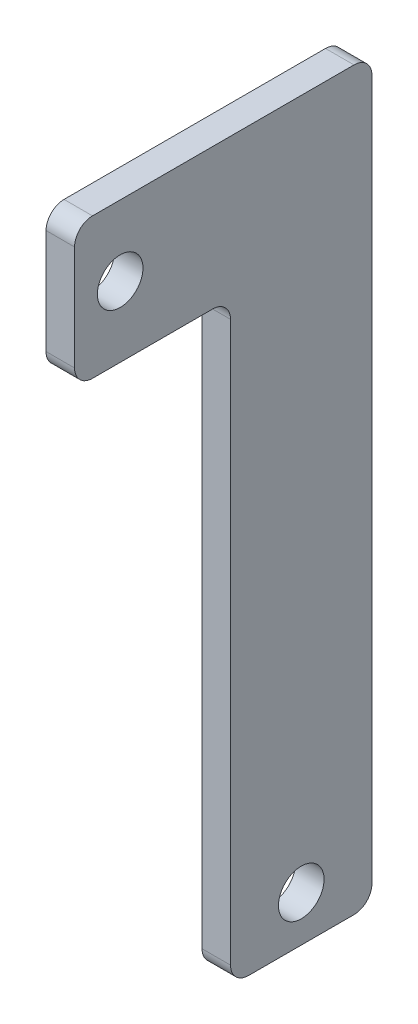
ISO-10303-21;
HEADER;
FILE_DESCRIPTION(('STEP AP214'),'2;1');
FILE_NAME('part.step','',(''),(''),'','','');
FILE_SCHEMA(('AUTOMOTIVE_DESIGN { 1 0 10303 214 1 1 1 1 }'));
ENDSEC;
DATA;
#1=APPLICATION_CONTEXT('core data for automotive mechanical design processes');
#2=APPLICATION_PROTOCOL_DEFINITION('international standard','automotive_design',2000,#1);
#3=PRODUCT_CONTEXT('',#1,'mechanical');
#4=PRODUCT('Part','Part','',(#3));
#5=PRODUCT_RELATED_PRODUCT_CATEGORY('part','',(#4));
#6=PRODUCT_DEFINITION_FORMATION('','',#4);
#7=PRODUCT_DEFINITION_CONTEXT('part definition',#1,'design');
#8=PRODUCT_DEFINITION('design','',#6,#7);
#9=PRODUCT_DEFINITION_SHAPE('','',#8);
#10=(LENGTH_UNIT() NAMED_UNIT(*) SI_UNIT(.MILLI.,.METRE.));
#11=(NAMED_UNIT(*) PLANE_ANGLE_UNIT() SI_UNIT($,.RADIAN.));
#12=(NAMED_UNIT(*) SI_UNIT($,.STERADIAN.) SOLID_ANGLE_UNIT());
#13=UNCERTAINTY_MEASURE_WITH_UNIT(LENGTH_MEASURE(1.E-05),#10,'distance_accuracy_value','');
#14=(GEOMETRIC_REPRESENTATION_CONTEXT(3) GLOBAL_UNCERTAINTY_ASSIGNED_CONTEXT((#13)) GLOBAL_UNIT_ASSIGNED_CONTEXT((#10,
#11,#12)) REPRESENTATION_CONTEXT('',''));
#15=CARTESIAN_POINT('',(0.,0.,0.));
#16=DIRECTION('',(0.,0.,1.));
#17=DIRECTION('',(1.,0.,0.));
#18=AXIS2_PLACEMENT_3D('',#15,#16,#17);
#19=CARTESIAN_POINT('',(-46.2500329826111,127.917372069071,94.0054482425765));
#20=DIRECTION('',(0.,0.,1.));
#21=DIRECTION('',(1.,0.,0.));
#22=AXIS2_PLACEMENT_3D('',#19,#20,#21);
#23=PLANE('',#22);
#24=DIRECTION('',(0.,1.,0.));
#25=VECTOR('',#24,1.);
#26=CARTESIAN_POINT('',(-46.2500329826111,127.917372069071,94.0054482425765));
#27=LINE('',#26,#25);
#28=CARTESIAN_POINT('',(-46.2500329826111,129.917372069071,94.0054482425765));
#29=VERTEX_POINT('',#28);
#30=CARTESIAN_POINT('',(-46.2500329826114,207.868558181533,94.0054482425765));
#31=VERTEX_POINT('',#30);
#32=EDGE_CURVE('E159',#29,#31,#27,.T.);
#33=ORIENTED_EDGE('',*,*,#32,.F.);
#34=DIRECTION('',(-1.,0.,0.));
#35=VECTOR('',#34,1.);
#36=CARTESIAN_POINT('',(-46.2500329826111,129.917372069071,94.0054482425765));
#37=LINE('',#36,#35);
#38=CARTESIAN_POINT('',(-49.4250329826111,129.917372069071,94.0054482425765));
#39=VERTEX_POINT('',#38);
#40=EDGE_CURVE('E190',#29,#39,#37,.T.);
#41=ORIENTED_EDGE('',*,*,#40,.T.);
#42=DIRECTION('',(0.,1.,0.));
#43=VECTOR('',#42,1.);
#44=CARTESIAN_POINT('',(-49.4250329826111,127.917372069071,94.0054482425765));
#45=LINE('',#44,#43);
#46=CARTESIAN_POINT('',(-49.4250329826114,207.868558181533,94.0054482425765));
#47=VERTEX_POINT('',#46);
#48=EDGE_CURVE('E227',#39,#47,#45,.T.);
#49=ORIENTED_EDGE('',*,*,#48,.T.);
#50=DIRECTION('',(-1.,0.,0.));
#51=VECTOR('',#50,1.);
#52=CARTESIAN_POINT('',(-46.2500329826114,207.868558181533,94.0054482425765));
#53=LINE('',#52,#51);
#54=EDGE_CURVE('E188',#47,#31,#53,.F.);
#55=ORIENTED_EDGE('',*,*,#54,.T.);
#56=EDGE_LOOP('',(#33,#41,#49,#55));
#57=FACE_BOUND('',#56,.T.);
#58=ADVANCED_FACE('F43',(#57),#23,.F.);
#59=CARTESIAN_POINT('',(-46.2500329826114,209.868558181533,109.749301698677));
#60=DIRECTION('',(0.,-1.,0.));
#61=DIRECTION('',(1.,0.,0.));
#62=AXIS2_PLACEMENT_3D('',#59,#60,#61);
#63=PLANE('',#62);
#64=DIRECTION('',(0.,0.,1.));
#65=VECTOR('',#64,1.);
#66=CARTESIAN_POINT('',(-46.2500329826114,209.868558181533,94.0054482425765));
#67=LINE('',#66,#65);
#68=CARTESIAN_POINT('',(-46.2500329826114,209.868558181533,96.0054482425765));
#69=VERTEX_POINT('',#68);
#70=CARTESIAN_POINT('',(-46.2500329826114,209.868558181533,125.122990112191));
#71=VERTEX_POINT('',#70);
#72=EDGE_CURVE('E163',#69,#71,#67,.T.);
#73=ORIENTED_EDGE('',*,*,#72,.F.);
#74=DIRECTION('',(-1.,0.,0.));
#75=VECTOR('',#74,1.);
#76=CARTESIAN_POINT('',(-46.2500329826114,209.868558181533,96.0054482425765));
#77=LINE('',#76,#75);
#78=CARTESIAN_POINT('',(-49.4250329826114,209.868558181533,96.0054482425765));
#79=VERTEX_POINT('',#78);
#80=EDGE_CURVE('E195',#69,#79,#77,.T.);
#81=ORIENTED_EDGE('',*,*,#80,.T.);
#82=DIRECTION('',(0.,0.,1.));
#83=VECTOR('',#82,1.);
#84=CARTESIAN_POINT('',(-49.4250329826114,209.868558181533,109.749301698677));
#85=LINE('',#84,#83);
#86=CARTESIAN_POINT('',(-49.4250329826114,209.868558181533,125.122990112191));
#87=VERTEX_POINT('',#86);
#88=EDGE_CURVE('E230',#79,#87,#85,.T.);
#89=ORIENTED_EDGE('',*,*,#88,.T.);
#90=DIRECTION('',(-1.,0.,0.));
#91=VECTOR('',#90,1.);
#92=CARTESIAN_POINT('',(-46.2500329826114,209.868558181533,125.122990112191));
#93=LINE('',#92,#91);
#94=EDGE_CURVE('E193',#87,#71,#93,.F.);
#95=ORIENTED_EDGE('',*,*,#94,.T.);
#96=EDGE_LOOP('',(#73,#81,#89,#95));
#97=FACE_BOUND('',#96,.T.);
#98=ADVANCED_FACE('F249',(#97),#63,.F.);
#99=CARTESIAN_POINT('',(-46.2500329826114,209.868558181533,127.122990112191));
#100=DIRECTION('',(0.,0.,-1.));
#101=DIRECTION('',(-1.,0.,0.));
#102=AXIS2_PLACEMENT_3D('',#99,#100,#101);
#103=PLANE('',#102);
#104=DIRECTION('',(0.,-1.,0.));
#105=VECTOR('',#104,1.);
#106=CARTESIAN_POINT('',(-46.2500329826114,209.868558181533,127.122990112191));
#107=LINE('',#106,#105);
#108=CARTESIAN_POINT('',(-46.2500329826114,207.868558181533,127.122990112191));
#109=VERTEX_POINT('',#108);
#110=CARTESIAN_POINT('',(-46.2500329826113,196.197401704372,127.122990112191));
#111=VERTEX_POINT('',#110);
#112=EDGE_CURVE('E223',#109,#111,#107,.T.);
#113=ORIENTED_EDGE('',*,*,#112,.F.);
#114=DIRECTION('',(-1.,0.,0.));
#115=VECTOR('',#114,1.);
#116=CARTESIAN_POINT('',(-46.2500329826114,207.868558181533,127.122990112191));
#117=LINE('',#116,#115);
#118=CARTESIAN_POINT('',(-49.4250329826114,207.868558181533,127.122990112191));
#119=VERTEX_POINT('',#118);
#120=EDGE_CURVE('E204',#109,#119,#117,.T.);
#121=ORIENTED_EDGE('',*,*,#120,.T.);
#122=DIRECTION('',(0.,-1.,0.));
#123=VECTOR('',#122,1.);
#124=CARTESIAN_POINT('',(-49.4250329826114,209.868558181533,127.122990112191));
#125=LINE('',#124,#123);
#126=CARTESIAN_POINT('',(-49.4250329826113,196.197401704372,127.122990112191));
#127=VERTEX_POINT('',#126);
#128=EDGE_CURVE('E211',#119,#127,#125,.T.);
#129=ORIENTED_EDGE('',*,*,#128,.T.);
#130=DIRECTION('',(-1.,0.,0.));
#131=VECTOR('',#130,1.);
#132=CARTESIAN_POINT('',(-46.2500329826113,196.197401704372,127.122990112191));
#133=LINE('',#132,#131);
#134=EDGE_CURVE('E202',#127,#111,#133,.F.);
#135=ORIENTED_EDGE('',*,*,#134,.T.);
#136=EDGE_LOOP('',(#113,#121,#129,#135));
#137=FACE_BOUND('',#136,.T.);
#138=ADVANCED_FACE('F239',(#137),#103,.F.);
#139=CARTESIAN_POINT('',(-46.2500329826113,194.197401704372,109.749301698677));
#140=DIRECTION('',(0.,1.,0.));
#141=DIRECTION('',(-1.,0.,0.));
#142=AXIS2_PLACEMENT_3D('',#139,#140,#141);
#143=PLANE('',#142);
#144=DIRECTION('',(0.,0.,-1.));
#145=VECTOR('',#144,1.);
#146=CARTESIAN_POINT('',(-49.4250329826113,194.197401704372,109.749301698677));
#147=LINE('',#146,#145);
#148=CARTESIAN_POINT('',(-49.4250329826113,194.197401704372,125.122990112191));
#149=VERTEX_POINT('',#148);
#150=CARTESIAN_POINT('',(-49.4250329826113,194.197401704372,111.749301698677));
#151=VERTEX_POINT('',#150);
#152=EDGE_CURVE('E165',#149,#151,#147,.T.);
#153=ORIENTED_EDGE('',*,*,#152,.T.);
#154=DIRECTION('',(-1.,0.,0.));
#155=VECTOR('',#154,1.);
#156=CARTESIAN_POINT('',(-46.2500329826113,194.197401704372,111.749301698677));
#157=LINE('',#156,#155);
#158=CARTESIAN_POINT('',(-46.2500329826113,194.197401704372,111.749301698677));
#159=VERTEX_POINT('',#158);
#160=EDGE_CURVE('E58',#151,#159,#157,.F.);
#161=ORIENTED_EDGE('',*,*,#160,.T.);
#162=DIRECTION('',(0.,0.,-1.));
#163=VECTOR('',#162,1.);
#164=CARTESIAN_POINT('',(-46.2500329826113,194.197401704372,109.749301698677));
#165=LINE('',#164,#163);
#166=CARTESIAN_POINT('',(-46.2500329826113,194.197401704372,125.122990112191));
#167=VERTEX_POINT('',#166);
#168=EDGE_CURVE('E218',#167,#159,#165,.T.);
#169=ORIENTED_EDGE('',*,*,#168,.F.);
#170=DIRECTION('',(-1.,0.,0.));
#171=VECTOR('',#170,1.);
#172=CARTESIAN_POINT('',(-46.2500329826113,194.197401704372,125.122990112191));
#173=LINE('',#172,#171);
#174=EDGE_CURVE('E198',#167,#149,#173,.T.);
#175=ORIENTED_EDGE('',*,*,#174,.T.);
#176=EDGE_LOOP('',(#153,#161,#169,#175));
#177=FACE_BOUND('',#176,.T.);
#178=ADVANCED_FACE('F209',(#177),#143,.F.);
#179=CARTESIAN_POINT('',(-46.2500329826111,127.917372069071,109.749301698677));
#180=DIRECTION('',(0.,0.,-1.));
#181=DIRECTION('',(-1.,0.,0.));
#182=AXIS2_PLACEMENT_3D('',#179,#180,#181);
#183=PLANE('',#182);
#184=DIRECTION('',(0.,-1.,0.));
#185=VECTOR('',#184,1.);
#186=CARTESIAN_POINT('',(-49.4250329826111,127.917372069071,109.749301698677));
#187=LINE('',#186,#185);
#188=CARTESIAN_POINT('',(-49.4250329826113,192.197401704372,109.749301698677));
#189=VERTEX_POINT('',#188);
#190=CARTESIAN_POINT('',(-49.4250329826111,129.917372069071,109.749301698677));
#191=VERTEX_POINT('',#190);
#192=EDGE_CURVE('E160',#189,#191,#187,.T.);
#193=ORIENTED_EDGE('',*,*,#192,.T.);
#194=DIRECTION('',(-1.,0.,0.));
#195=VECTOR('',#194,1.);
#196=CARTESIAN_POINT('',(-46.2500329826111,129.917372069071,109.749301698677));
#197=LINE('',#196,#195);
#198=CARTESIAN_POINT('',(-46.2500329826111,129.917372069071,109.749301698677));
#199=VERTEX_POINT('',#198);
#200=EDGE_CURVE('E138',#191,#199,#197,.F.);
#201=ORIENTED_EDGE('',*,*,#200,.T.);
#202=DIRECTION('',(0.,-1.,0.));
#203=VECTOR('',#202,1.);
#204=CARTESIAN_POINT('',(-46.2500329826111,127.917372069071,109.749301698677));
#205=LINE('',#204,#203);
#206=CARTESIAN_POINT('',(-46.2500329826113,192.197401704372,109.749301698677));
#207=VERTEX_POINT('',#206);
#208=EDGE_CURVE('E217',#207,#199,#205,.T.);
#209=ORIENTED_EDGE('',*,*,#208,.F.);
#210=DIRECTION('',(-1.,0.,0.));
#211=VECTOR('',#210,1.);
#212=CARTESIAN_POINT('',(-49.4250329826113,192.197401704372,109.749301698677));
#213=LINE('',#212,#211);
#214=EDGE_CURVE('E143',#207,#189,#213,.T.);
#215=ORIENTED_EDGE('',*,*,#214,.T.);
#216=EDGE_LOOP('',(#193,#201,#209,#215));
#217=FACE_BOUND('',#216,.T.);
#218=ADVANCED_FACE('F220',(#217),#183,.F.);
#219=CARTESIAN_POINT('',(-46.2500329826111,127.917372069071,94.0054482425765));
#220=DIRECTION('',(0.,1.,0.));
#221=DIRECTION('',(-1.,0.,0.));
#222=AXIS2_PLACEMENT_3D('',#219,#220,#221);
#223=PLANE('',#222);
#224=DIRECTION('',(0.,0.,-1.));
#225=VECTOR('',#224,1.);
#226=CARTESIAN_POINT('',(-46.2500329826111,127.917372069071,94.0054482425765));
#227=LINE('',#226,#225);
#228=CARTESIAN_POINT('',(-46.2500329826111,127.917372069071,107.749301698677));
#229=VERTEX_POINT('',#228);
#230=CARTESIAN_POINT('',(-46.2500329826111,127.917372069071,96.0054482425765));
#231=VERTEX_POINT('',#230);
#232=EDGE_CURVE('E153',#229,#231,#227,.T.);
#233=ORIENTED_EDGE('',*,*,#232,.F.);
#234=DIRECTION('',(-1.,0.,0.));
#235=VECTOR('',#234,1.);
#236=CARTESIAN_POINT('',(-46.2500329826111,127.917372069071,107.749301698677));
#237=LINE('',#236,#235);
#238=CARTESIAN_POINT('',(-49.4250329826111,127.917372069071,107.749301698677));
#239=VERTEX_POINT('',#238);
#240=EDGE_CURVE('E137',#229,#239,#237,.T.);
#241=ORIENTED_EDGE('',*,*,#240,.T.);
#242=DIRECTION('',(0.,0.,-1.));
#243=VECTOR('',#242,1.);
#244=CARTESIAN_POINT('',(-49.4250329826111,127.917372069071,94.0054482425765));
#245=LINE('',#244,#243);
#246=CARTESIAN_POINT('',(-49.4250329826111,127.917372069071,96.0054482425765));
#247=VERTEX_POINT('',#246);
#248=EDGE_CURVE('E150',#239,#247,#245,.T.);
#249=ORIENTED_EDGE('',*,*,#248,.T.);
#250=DIRECTION('',(-1.,0.,0.));
#251=VECTOR('',#250,1.);
#252=CARTESIAN_POINT('',(-46.2500329826111,127.917372069071,96.0054482425765));
#253=LINE('',#252,#251);
#254=EDGE_CURVE('E155',#247,#231,#253,.F.);
#255=ORIENTED_EDGE('',*,*,#254,.T.);
#256=EDGE_LOOP('',(#233,#241,#249,#255));
#257=FACE_BOUND('',#256,.T.);
#258=ADVANCED_FACE('F149',(#257),#223,.F.);
#259=CARTESIAN_POINT('',(-46.2500329826106,-1.6467908666563E-13,0.));
#260=DIRECTION('',(1.,0.,0.));
#261=DIRECTION('',(0.,1.,0.));
#262=AXIS2_PLACEMENT_3D('',#259,#260,#261);
#263=PLANE('',#262);
#264=CARTESIAN_POINT('',(-46.2500329826108,132.997372069071,101.877374970627));
#265=DIRECTION('',(-1.,0.,0.));
#266=DIRECTION('',(0.,-1.,0.));
#267=AXIS2_PLACEMENT_3D('',#264,#265,#266);
#268=CIRCLE('',#267,2.54);
#269=CARTESIAN_POINT('',(-46.2500329826108,130.457372069071,101.877374970627));
#270=VERTEX_POINT('',#269);
#271=EDGE_CURVE('E231',#270,#270,#268,.T.);
#272=ORIENTED_EDGE('',*,*,#271,.T.);
#273=EDGE_LOOP('',(#272));
#274=FACE_BOUND('',#273,.T.);
#275=CARTESIAN_POINT('',(-46.250032982611,202.032979942952,122.042990112191));
#276=DIRECTION('',(-1.,0.,0.));
#277=DIRECTION('',(0.,-1.,0.));
#278=AXIS2_PLACEMENT_3D('',#275,#276,#277);
#279=CIRCLE('',#278,2.54);
#280=CARTESIAN_POINT('',(-46.250032982611,199.492979942952,122.042990112191));
#281=VERTEX_POINT('',#280);
#282=EDGE_CURVE('E410',#281,#281,#279,.T.);
#283=ORIENTED_EDGE('',*,*,#282,.T.);
#284=EDGE_LOOP('',(#283));
#285=FACE_BOUND('',#284,.T.);
#286=ORIENTED_EDGE('',*,*,#208,.T.);
#287=CARTESIAN_POINT('',(-46.2500329826111,129.917372069071,107.749301698677));
#288=DIRECTION('',(1.,0.,0.));
#289=DIRECTION('',(0.,1.,0.));
#290=AXIS2_PLACEMENT_3D('',#287,#288,#289);
#291=CIRCLE('',#290,2.);
#292=EDGE_CURVE('E186',#199,#229,#291,.T.);
#293=ORIENTED_EDGE('',*,*,#292,.T.);
#294=ORIENTED_EDGE('',*,*,#232,.T.);
#295=CARTESIAN_POINT('',(-46.2500329826111,129.917372069071,96.0054482425765));
#296=DIRECTION('',(1.,0.,0.));
#297=DIRECTION('',(0.,1.,0.));
#298=AXIS2_PLACEMENT_3D('',#295,#296,#297);
#299=CIRCLE('',#298,2.);
#300=EDGE_CURVE('E184',#231,#29,#299,.T.);
#301=ORIENTED_EDGE('',*,*,#300,.T.);
#302=ORIENTED_EDGE('',*,*,#32,.T.);
#303=CARTESIAN_POINT('',(-46.2500329826114,207.868558181533,96.0054482425765));
#304=DIRECTION('',(1.,0.,0.));
#305=DIRECTION('',(0.,1.,0.));
#306=AXIS2_PLACEMENT_3D('',#303,#304,#305);
#307=CIRCLE('',#306,2.);
#308=EDGE_CURVE('E182',#31,#69,#307,.T.);
#309=ORIENTED_EDGE('',*,*,#308,.T.);
#310=ORIENTED_EDGE('',*,*,#72,.T.);
#311=CARTESIAN_POINT('',(-46.2500329826114,207.868558181533,125.122990112191));
#312=DIRECTION('',(1.,0.,0.));
#313=DIRECTION('',(0.,1.,0.));
#314=AXIS2_PLACEMENT_3D('',#311,#312,#313);
#315=CIRCLE('',#314,2.);
#316=EDGE_CURVE('E180',#71,#109,#315,.T.);
#317=ORIENTED_EDGE('',*,*,#316,.T.);
#318=ORIENTED_EDGE('',*,*,#112,.T.);
#319=CARTESIAN_POINT('',(-46.2500329826113,196.197401704372,125.122990112191));
#320=DIRECTION('',(1.,0.,0.));
#321=DIRECTION('',(0.,1.,0.));
#322=AXIS2_PLACEMENT_3D('',#319,#320,#321);
#323=CIRCLE('',#322,2.);
#324=EDGE_CURVE('E65',#111,#167,#323,.T.);
#325=ORIENTED_EDGE('',*,*,#324,.T.);
#326=ORIENTED_EDGE('',*,*,#168,.T.);
#327=CARTESIAN_POINT('',(-46.2500329826113,192.197401704372,111.749301698677));
#328=DIRECTION('',(1.,0.,0.));
#329=DIRECTION('',(0.,1.,0.));
#330=AXIS2_PLACEMENT_3D('',#327,#328,#329);
#331=CIRCLE('',#330,2.);
#332=EDGE_CURVE('E11',#159,#207,#331,.F.);
#333=ORIENTED_EDGE('',*,*,#332,.T.);
#334=EDGE_LOOP('',(#286,#293,#294,#301,#302,#309,#310,#317,#318,#325,#326,#333));
#335=FACE_BOUND('',#334,.T.);
#336=ADVANCED_FACE('F216',(#274,#285,#335),#263,.T.);
#337=CARTESIAN_POINT('',(-49.4250329826106,-1.75764539916457E-13,0.));
#338=DIRECTION('',(1.,0.,0.));
#339=DIRECTION('',(0.,1.,0.));
#340=AXIS2_PLACEMENT_3D('',#337,#338,#339);
#341=PLANE('',#340);
#342=CARTESIAN_POINT('',(-49.4250329826111,132.997372069071,101.877374970627));
#343=DIRECTION('',(-1.,0.,0.));
#344=DIRECTION('',(0.,-1.,0.));
#345=AXIS2_PLACEMENT_3D('',#342,#343,#344);
#346=CIRCLE('',#345,2.54);
#347=CARTESIAN_POINT('',(-49.4250329826111,130.457372069071,101.877374970627));
#348=VERTEX_POINT('',#347);
#349=EDGE_CURVE('E414',#348,#348,#346,.T.);
#350=ORIENTED_EDGE('',*,*,#349,.F.);
#351=EDGE_LOOP('',(#350));
#352=FACE_BOUND('',#351,.T.);
#353=CARTESIAN_POINT('',(-49.4250329826113,202.032979942952,122.042990112191));
#354=DIRECTION('',(-1.,0.,0.));
#355=DIRECTION('',(0.,-1.,0.));
#356=AXIS2_PLACEMENT_3D('',#353,#354,#355);
#357=CIRCLE('',#356,2.54);
#358=CARTESIAN_POINT('',(-49.4250329826113,199.492979942952,122.042990112191));
#359=VERTEX_POINT('',#358);
#360=EDGE_CURVE('E411',#359,#359,#357,.T.);
#361=ORIENTED_EDGE('',*,*,#360,.F.);
#362=EDGE_LOOP('',(#361));
#363=FACE_BOUND('',#362,.T.);
#364=ORIENTED_EDGE('',*,*,#248,.F.);
#365=CARTESIAN_POINT('',(-49.4250329826111,129.917372069071,107.749301698677));
#366=DIRECTION('',(1.,0.,0.));
#367=DIRECTION('',(0.,1.,0.));
#368=AXIS2_PLACEMENT_3D('',#365,#366,#367);
#369=CIRCLE('',#368,2.);
#370=EDGE_CURVE('E133',#239,#191,#369,.F.);
#371=ORIENTED_EDGE('',*,*,#370,.T.);
#372=ORIENTED_EDGE('',*,*,#192,.F.);
#373=CARTESIAN_POINT('',(-49.4250329826113,192.197401704372,111.749301698677));
#374=DIRECTION('',(1.,0.,0.));
#375=DIRECTION('',(0.,1.,0.));
#376=AXIS2_PLACEMENT_3D('',#373,#374,#375);
#377=CIRCLE('',#376,2.);
#378=EDGE_CURVE('E51',#189,#151,#377,.T.);
#379=ORIENTED_EDGE('',*,*,#378,.T.);
#380=ORIENTED_EDGE('',*,*,#152,.F.);
#381=CARTESIAN_POINT('',(-49.4250329826113,196.197401704372,125.122990112191));
#382=DIRECTION('',(1.,0.,0.));
#383=DIRECTION('',(0.,1.,0.));
#384=AXIS2_PLACEMENT_3D('',#381,#382,#383);
#385=CIRCLE('',#384,2.);
#386=EDGE_CURVE('E154',#149,#127,#385,.F.);
#387=ORIENTED_EDGE('',*,*,#386,.T.);
#388=ORIENTED_EDGE('',*,*,#128,.F.);
#389=CARTESIAN_POINT('',(-49.4250329826114,207.868558181533,125.122990112191));
#390=DIRECTION('',(1.,0.,0.));
#391=DIRECTION('',(0.,1.,0.));
#392=AXIS2_PLACEMENT_3D('',#389,#390,#391);
#393=CIRCLE('',#392,2.);
#394=EDGE_CURVE('E171',#119,#87,#393,.F.);
#395=ORIENTED_EDGE('',*,*,#394,.T.);
#396=ORIENTED_EDGE('',*,*,#88,.F.);
#397=CARTESIAN_POINT('',(-49.4250329826114,207.868558181533,96.0054482425765));
#398=DIRECTION('',(1.,0.,0.));
#399=DIRECTION('',(0.,1.,0.));
#400=AXIS2_PLACEMENT_3D('',#397,#398,#399);
#401=CIRCLE('',#400,2.);
#402=EDGE_CURVE('E173',#79,#47,#401,.F.);
#403=ORIENTED_EDGE('',*,*,#402,.T.);
#404=ORIENTED_EDGE('',*,*,#48,.F.);
#405=CARTESIAN_POINT('',(-49.4250329826111,129.917372069071,96.0054482425765));
#406=DIRECTION('',(1.,0.,0.));
#407=DIRECTION('',(0.,1.,0.));
#408=AXIS2_PLACEMENT_3D('',#405,#406,#407);
#409=CIRCLE('',#408,2.);
#410=EDGE_CURVE('E144',#39,#247,#409,.F.);
#411=ORIENTED_EDGE('',*,*,#410,.T.);
#412=EDGE_LOOP('',(#364,#371,#372,#379,#380,#387,#388,#395,#396,#403,#404,#411));
#413=FACE_BOUND('',#412,.T.);
#414=ADVANCED_FACE('F157',(#352,#363,#413),#341,.F.);
#415=CARTESIAN_POINT('',(-46.250032982611,202.032979942952,122.042990112191));
#416=DIRECTION('',(-1.,0.,0.));
#417=DIRECTION('',(0.,-1.,0.));
#418=AXIS2_PLACEMENT_3D('',#415,#416,#417);
#419=CYLINDRICAL_SURFACE('',#418,2.54);
#420=ORIENTED_EDGE('',*,*,#282,.F.);
#421=EDGE_LOOP('',(#420));
#422=FACE_BOUND('',#421,.T.);
#423=ORIENTED_EDGE('',*,*,#360,.T.);
#424=EDGE_LOOP('',(#423));
#425=FACE_BOUND('',#424,.T.);
#426=ADVANCED_FACE('F310',(#422,#425),#419,.F.);
#427=CARTESIAN_POINT('',(-46.2500329826108,132.997372069071,101.877374970627));
#428=DIRECTION('',(-1.,0.,0.));
#429=DIRECTION('',(0.,-1.,0.));
#430=AXIS2_PLACEMENT_3D('',#427,#428,#429);
#431=CYLINDRICAL_SURFACE('',#430,2.54);
#432=ORIENTED_EDGE('',*,*,#271,.F.);
#433=EDGE_LOOP('',(#432));
#434=FACE_BOUND('',#433,.T.);
#435=ORIENTED_EDGE('',*,*,#349,.T.);
#436=EDGE_LOOP('',(#435));
#437=FACE_BOUND('',#436,.T.);
#438=ADVANCED_FACE('F264',(#434,#437),#431,.F.);
#439=CARTESIAN_POINT('',(-46.2500329826111,129.917372069071,107.749301698677));
#440=DIRECTION('',(-1.,0.,0.));
#441=DIRECTION('',(0.,-1.,0.));
#442=AXIS2_PLACEMENT_3D('',#439,#440,#441);
#443=CYLINDRICAL_SURFACE('',#442,2.);
#444=ORIENTED_EDGE('',*,*,#292,.F.);
#445=ORIENTED_EDGE('',*,*,#200,.F.);
#446=ORIENTED_EDGE('',*,*,#370,.F.);
#447=ORIENTED_EDGE('',*,*,#240,.F.);
#448=EDGE_LOOP('',(#444,#445,#446,#447));
#449=FACE_BOUND('',#448,.T.);
#450=ADVANCED_FACE('F136',(#449),#443,.T.);
#451=CARTESIAN_POINT('',(-46.2500329826111,129.917372069071,96.0054482425765));
#452=DIRECTION('',(-1.,0.,0.));
#453=DIRECTION('',(0.,-1.,0.));
#454=AXIS2_PLACEMENT_3D('',#451,#452,#453);
#455=CYLINDRICAL_SURFACE('',#454,2.);
#456=ORIENTED_EDGE('',*,*,#300,.F.);
#457=ORIENTED_EDGE('',*,*,#254,.F.);
#458=ORIENTED_EDGE('',*,*,#410,.F.);
#459=ORIENTED_EDGE('',*,*,#40,.F.);
#460=EDGE_LOOP('',(#456,#457,#458,#459));
#461=FACE_BOUND('',#460,.T.);
#462=ADVANCED_FACE('F263',(#461),#455,.T.);
#463=CARTESIAN_POINT('',(-46.2500329826114,207.868558181533,96.0054482425765));
#464=DIRECTION('',(-1.,0.,0.));
#465=DIRECTION('',(0.,-1.,0.));
#466=AXIS2_PLACEMENT_3D('',#463,#464,#465);
#467=CYLINDRICAL_SURFACE('',#466,2.);
#468=ORIENTED_EDGE('',*,*,#308,.F.);
#469=ORIENTED_EDGE('',*,*,#54,.F.);
#470=ORIENTED_EDGE('',*,*,#402,.F.);
#471=ORIENTED_EDGE('',*,*,#80,.F.);
#472=EDGE_LOOP('',(#468,#469,#470,#471));
#473=FACE_BOUND('',#472,.T.);
#474=ADVANCED_FACE('F267',(#473),#467,.T.);
#475=CARTESIAN_POINT('',(-46.2500329826113,192.197401704372,111.749301698677));
#476=DIRECTION('',(1.,0.,0.));
#477=DIRECTION('',(0.,1.,0.));
#478=AXIS2_PLACEMENT_3D('',#475,#476,#477);
#479=CYLINDRICAL_SURFACE('',#478,2.);
#480=ORIENTED_EDGE('',*,*,#332,.F.);
#481=ORIENTED_EDGE('',*,*,#160,.F.);
#482=ORIENTED_EDGE('',*,*,#378,.F.);
#483=ORIENTED_EDGE('',*,*,#214,.F.);
#484=EDGE_LOOP('',(#480,#481,#482,#483));
#485=FACE_BOUND('',#484,.T.);
#486=ADVANCED_FACE('F213',(#485),#479,.F.);
#487=CARTESIAN_POINT('',(-46.2500329826114,207.868558181533,125.122990112191));
#488=DIRECTION('',(-1.,0.,0.));
#489=DIRECTION('',(0.,-1.,0.));
#490=AXIS2_PLACEMENT_3D('',#487,#488,#489);
#491=CYLINDRICAL_SURFACE('',#490,2.);
#492=ORIENTED_EDGE('',*,*,#316,.F.);
#493=ORIENTED_EDGE('',*,*,#94,.F.);
#494=ORIENTED_EDGE('',*,*,#394,.F.);
#495=ORIENTED_EDGE('',*,*,#120,.F.);
#496=EDGE_LOOP('',(#492,#493,#494,#495));
#497=FACE_BOUND('',#496,.T.);
#498=ADVANCED_FACE('F243',(#497),#491,.T.);
#499=CARTESIAN_POINT('',(-46.2500329826113,196.197401704372,125.122990112191));
#500=DIRECTION('',(-1.,0.,0.));
#501=DIRECTION('',(0.,-1.,0.));
#502=AXIS2_PLACEMENT_3D('',#499,#500,#501);
#503=CYLINDRICAL_SURFACE('',#502,2.);
#504=ORIENTED_EDGE('',*,*,#324,.F.);
#505=ORIENTED_EDGE('',*,*,#134,.F.);
#506=ORIENTED_EDGE('',*,*,#386,.F.);
#507=ORIENTED_EDGE('',*,*,#174,.F.);
#508=EDGE_LOOP('',(#504,#505,#506,#507));
#509=FACE_BOUND('',#508,.T.);
#510=ADVANCED_FACE('F45',(#509),#503,.T.);
#511=CLOSED_SHELL('',(#58,#98,#138,#178,#218,#258,#336,#414,#426,#438,#450,#462,#474,#486,#498,#510));
#512=MANIFOLD_SOLID_BREP('B2',#511);
#513=ADVANCED_BREP_SHAPE_REPRESENTATION('',(#18,#512),#14);
#514=SHAPE_DEFINITION_REPRESENTATION(#9,#513);
ENDSEC;
END-ISO-10303-21;
